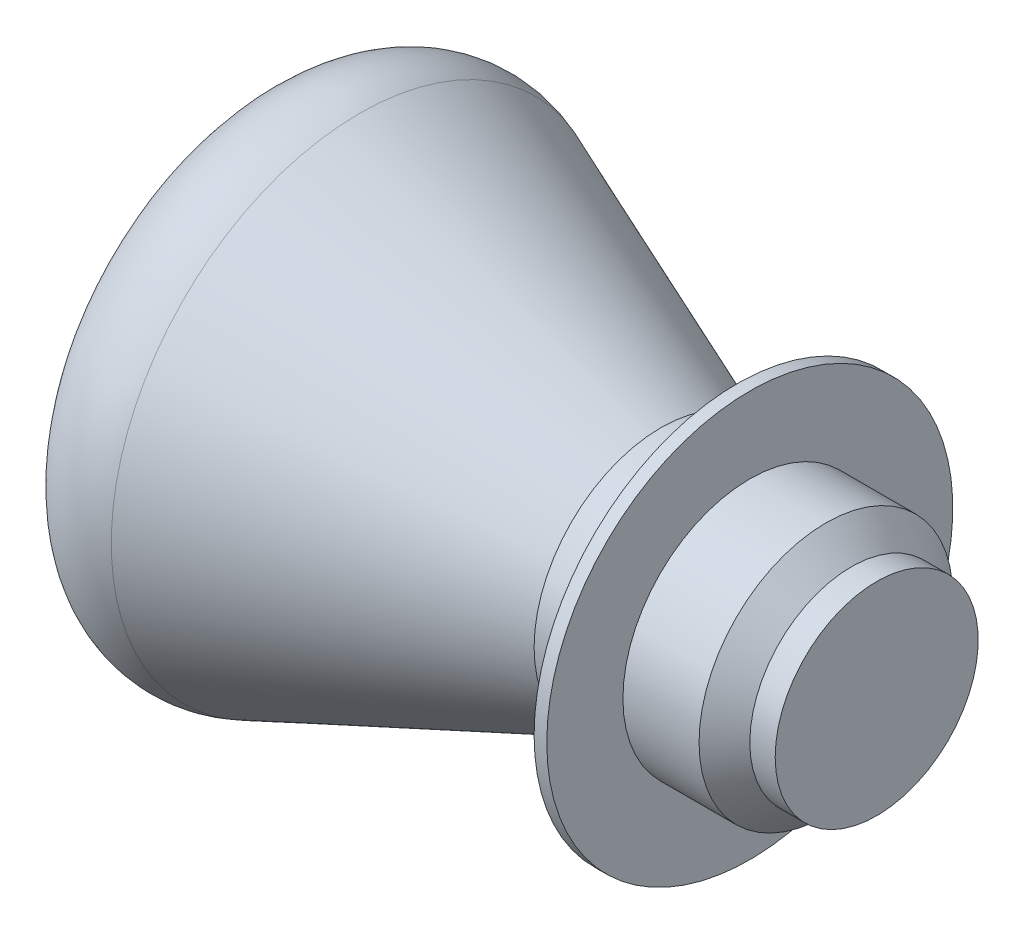
ISO-10303-21;
HEADER;
FILE_DESCRIPTION(('STEP AP214'),'2;1');
FILE_NAME('part.step','',(''),(''),'','','');
FILE_SCHEMA(('AUTOMOTIVE_DESIGN { 1 0 10303 214 1 1 1 1 }'));
ENDSEC;
DATA;
#1=APPLICATION_CONTEXT('core data for automotive mechanical design processes');
#2=APPLICATION_PROTOCOL_DEFINITION('international standard','automotive_design',2000,#1);
#3=PRODUCT_CONTEXT('',#1,'mechanical');
#4=PRODUCT('Part','Part','',(#3));
#5=PRODUCT_RELATED_PRODUCT_CATEGORY('part','',(#4));
#6=PRODUCT_DEFINITION_FORMATION('','',#4);
#7=PRODUCT_DEFINITION_CONTEXT('part definition',#1,'design');
#8=PRODUCT_DEFINITION('design','',#6,#7);
#9=PRODUCT_DEFINITION_SHAPE('','',#8);
#10=(LENGTH_UNIT() NAMED_UNIT(*) SI_UNIT(.MILLI.,.METRE.));
#11=(NAMED_UNIT(*) PLANE_ANGLE_UNIT() SI_UNIT($,.RADIAN.));
#12=(NAMED_UNIT(*) SI_UNIT($,.STERADIAN.) SOLID_ANGLE_UNIT());
#13=UNCERTAINTY_MEASURE_WITH_UNIT(LENGTH_MEASURE(1.E-05),#10,'distance_accuracy_value','');
#14=(GEOMETRIC_REPRESENTATION_CONTEXT(3) GLOBAL_UNCERTAINTY_ASSIGNED_CONTEXT((#13)) GLOBAL_UNIT_ASSIGNED_CONTEXT((#10,
#11,#12)) REPRESENTATION_CONTEXT('',''));
#15=CARTESIAN_POINT('',(0.,0.,0.));
#16=DIRECTION('',(0.,0.,1.));
#17=DIRECTION('',(1.,0.,0.));
#18=AXIS2_PLACEMENT_3D('',#15,#16,#17);
#19=CARTESIAN_POINT('',(0.,0.,0.));
#20=DIRECTION('',(1.,0.,0.));
#21=DIRECTION('',(0.,1.,0.));
#22=AXIS2_PLACEMENT_3D('',#19,#20,#21);
#23=PLANE('',#22);
#24=CARTESIAN_POINT('',(0.,0.,0.));
#25=DIRECTION('',(1.,0.,0.));
#26=DIRECTION('',(0.,1.,0.));
#27=AXIS2_PLACEMENT_3D('',#24,#25,#26);
#28=CIRCLE('',#27,5.);
#29=CARTESIAN_POINT('',(0.,5.,0.));
#30=VERTEX_POINT('',#29);
#31=EDGE_CURVE('E11',#30,#30,#28,.T.);
#32=ORIENTED_EDGE('',*,*,#31,.T.);
#33=EDGE_LOOP('',(#32));
#34=FACE_BOUND('',#33,.T.);
#35=ADVANCED_FACE('F47',(#34),#23,.T.);
#36=CARTESIAN_POINT('',(0.,0.,0.));
#37=DIRECTION('',(1.,0.,0.));
#38=DIRECTION('',(0.,1.,0.));
#39=AXIS2_PLACEMENT_3D('',#36,#37,#38);
#40=CYLINDRICAL_SURFACE('',#39,5.);
#41=CARTESIAN_POINT('',(-3.,0.,0.));
#42=DIRECTION('',(1.,0.,0.));
#43=DIRECTION('',(0.,1.,0.));
#44=AXIS2_PLACEMENT_3D('',#41,#42,#43);
#45=CIRCLE('',#44,5.);
#46=CARTESIAN_POINT('',(-3.,5.,0.));
#47=VERTEX_POINT('',#46);
#48=EDGE_CURVE('E54',#47,#47,#45,.T.);
#49=ORIENTED_EDGE('',*,*,#48,.T.);
#50=EDGE_LOOP('',(#49));
#51=FACE_BOUND('',#50,.T.);
#52=ORIENTED_EDGE('',*,*,#31,.F.);
#53=EDGE_LOOP('',(#52));
#54=FACE_BOUND('',#53,.T.);
#55=ADVANCED_FACE('F83',(#51,#54),#40,.T.);
#56=CARTESIAN_POINT('',(-3.,0.,0.));
#57=DIRECTION('',(-1.,0.,0.));
#58=DIRECTION('',(0.,-1.,0.));
#59=AXIS2_PLACEMENT_3D('',#56,#57,#58);
#60=CONICAL_SURFACE('',#59,5.,0.382760510475256);
#61=CARTESIAN_POINT('',(-14.8795520760162,0.,0.));
#62=DIRECTION('',(1.,0.,0.));
#63=DIRECTION('',(0.,1.,0.));
#64=AXIS2_PLACEMENT_3D('',#61,#62,#63);
#65=CIRCLE('',#64,9.78291150589458);
#66=CARTESIAN_POINT('',(-14.8795520760162,9.78291150589458,0.));
#67=VERTEX_POINT('',#66);
#68=EDGE_CURVE('E59',#67,#67,#65,.T.);
#69=ORIENTED_EDGE('',*,*,#68,.T.);
#70=EDGE_LOOP('',(#69));
#71=FACE_BOUND('',#70,.T.);
#72=ORIENTED_EDGE('',*,*,#48,.F.);
#73=EDGE_LOOP('',(#72));
#74=FACE_BOUND('',#73,.T.);
#75=ADVANCED_FACE('F80',(#71,#74),#60,.T.);
#76=CARTESIAN_POINT('',(-16.,0.,0.));
#77=DIRECTION('',(1.,0.,0.));
#78=DIRECTION('',(0.,1.,0.));
#79=AXIS2_PLACEMENT_3D('',#76,#77,#78);
#80=TOROIDAL_SURFACE('',#79,7.,3.);
#81=CARTESIAN_POINT('',(-18.8803910346565,0.,0.));
#82=DIRECTION('',(1.,0.,0.));
#83=DIRECTION('',(0.,1.,0.));
#84=AXIS2_PLACEMENT_3D('',#81,#82,#83);
#85=CIRCLE('',#84,7.83865814696486);
#86=CARTESIAN_POINT('',(-18.8803910346565,7.83865814696485,0.));
#87=VERTEX_POINT('',#86);
#88=EDGE_CURVE('E64',#87,#87,#85,.T.);
#89=ORIENTED_EDGE('',*,*,#88,.T.);
#90=EDGE_LOOP('',(#89));
#91=FACE_BOUND('',#90,.T.);
#92=ORIENTED_EDGE('',*,*,#68,.F.);
#93=EDGE_LOOP('',(#92));
#94=FACE_BOUND('',#93,.T.);
#95=ADVANCED_FACE('F71',(#91,#94),#80,.T.);
#96=CARTESIAN_POINT('',(8.04166383593282,0.,0.));
#97=DIRECTION('',(1.,0.,0.));
#98=DIRECTION('',(0.,1.,0.));
#99=AXIS2_PLACEMENT_3D('',#96,#97,#98);
#100=SPHERICAL_SURFACE('',#99,28.04);
#101=ORIENTED_EDGE('',*,*,#88,.F.);
#102=EDGE_LOOP('',(#101));
#103=FACE_BOUND('',#102,.T.);
#104=ADVANCED_FACE('F74',(#103),#100,.T.);
#105=CLOSED_SHELL('',(#35,#55,#75,#95,#104));
#106=MANIFOLD_SOLID_BREP('B2',#105);
#107=CARTESIAN_POINT('',(0.,4.5,0.));
#108=DIRECTION('',(1.,0.,0.));
#109=DIRECTION('',(0.,0.,-1.));
#110=AXIS2_PLACEMENT_3D('',#107,#108,#109);
#111=PLANE('',#110);
#112=CARTESIAN_POINT('',(0.,0.,0.));
#113=DIRECTION('',(-1.,0.,0.));
#114=DIRECTION('',(0.,0.,1.));
#115=AXIS2_PLACEMENT_3D('',#112,#113,#114);
#116=CIRCLE('',#115,4.5);
#117=CARTESIAN_POINT('',(0.,0.,4.5));
#118=VERTEX_POINT('',#117);
#119=EDGE_CURVE('E156',#118,#118,#116,.T.);
#120=ORIENTED_EDGE('',*,*,#119,.T.);
#121=EDGE_LOOP('',(#120));
#122=FACE_BOUND('',#121,.T.);
#123=ADVANCED_FACE('F122',(#122),#111,.F.);
#124=CARTESIAN_POINT('',(5.5,0.,0.));
#125=DIRECTION('',(-1.,0.,0.));
#126=DIRECTION('',(0.,0.,1.));
#127=AXIS2_PLACEMENT_3D('',#124,#125,#126);
#128=PLANE('',#127);
#129=CARTESIAN_POINT('',(5.5,0.,0.));
#130=DIRECTION('',(-1.,0.,0.));
#131=DIRECTION('',(0.,0.,1.));
#132=AXIS2_PLACEMENT_3D('',#129,#130,#131);
#133=CIRCLE('',#132,4.);
#134=CARTESIAN_POINT('',(5.5,0.,4.));
#135=VERTEX_POINT('',#134);
#136=EDGE_CURVE('E46',#135,#135,#133,.T.);
#137=ORIENTED_EDGE('',*,*,#136,.F.);
#138=EDGE_LOOP('',(#137));
#139=FACE_BOUND('',#138,.T.);
#140=ADVANCED_FACE('F210',(#139),#128,.F.);
#141=CARTESIAN_POINT('',(0.,0.,0.));
#142=DIRECTION('',(-1.,0.,0.));
#143=DIRECTION('',(0.,0.,1.));
#144=AXIS2_PLACEMENT_3D('',#141,#142,#143);
#145=CYLINDRICAL_SURFACE('',#144,4.);
#146=CARTESIAN_POINT('',(4.5,0.,0.));
#147=DIRECTION('',(-1.,0.,0.));
#148=DIRECTION('',(0.,0.,1.));
#149=AXIS2_PLACEMENT_3D('',#146,#147,#148);
#150=CIRCLE('',#149,4.);
#151=CARTESIAN_POINT('',(4.5,0.,4.));
#152=VERTEX_POINT('',#151);
#153=EDGE_CURVE('E128',#152,#152,#150,.T.);
#154=ORIENTED_EDGE('',*,*,#153,.F.);
#155=EDGE_LOOP('',(#154));
#156=FACE_BOUND('',#155,.T.);
#157=ORIENTED_EDGE('',*,*,#136,.T.);
#158=EDGE_LOOP('',(#157));
#159=FACE_BOUND('',#158,.T.);
#160=ADVANCED_FACE('F205',(#156,#159),#145,.T.);
#161=CARTESIAN_POINT('',(4.5,0.,0.));
#162=DIRECTION('',(-1.,0.,0.));
#163=DIRECTION('',(0.,0.,1.));
#164=AXIS2_PLACEMENT_3D('',#161,#162,#163);
#165=CONICAL_SURFACE('',#164,4.,0.785398163397449);
#166=CARTESIAN_POINT('',(3.5,0.,0.));
#167=DIRECTION('',(-1.,0.,0.));
#168=DIRECTION('',(0.,0.,1.));
#169=AXIS2_PLACEMENT_3D('',#166,#167,#168);
#170=CIRCLE('',#169,5.);
#171=CARTESIAN_POINT('',(3.5,0.,5.));
#172=VERTEX_POINT('',#171);
#173=EDGE_CURVE('E132',#172,#172,#170,.T.);
#174=ORIENTED_EDGE('',*,*,#173,.F.);
#175=EDGE_LOOP('',(#174));
#176=FACE_BOUND('',#175,.T.);
#177=ORIENTED_EDGE('',*,*,#153,.T.);
#178=EDGE_LOOP('',(#177));
#179=FACE_BOUND('',#178,.T.);
#180=ADVANCED_FACE('F200',(#176,#179),#165,.T.);
#181=CARTESIAN_POINT('',(0.,0.,0.));
#182=DIRECTION('',(-1.,0.,0.));
#183=DIRECTION('',(0.,0.,1.));
#184=AXIS2_PLACEMENT_3D('',#181,#182,#183);
#185=CYLINDRICAL_SURFACE('',#184,5.);
#186=CARTESIAN_POINT('',(0.499999999999999,0.,0.));
#187=DIRECTION('',(-1.,0.,0.));
#188=DIRECTION('',(0.,0.,1.));
#189=AXIS2_PLACEMENT_3D('',#186,#187,#188);
#190=CIRCLE('',#189,5.);
#191=CARTESIAN_POINT('',(0.499999999999999,0.,5.));
#192=VERTEX_POINT('',#191);
#193=EDGE_CURVE('E136',#192,#192,#190,.T.);
#194=ORIENTED_EDGE('',*,*,#193,.F.);
#195=EDGE_LOOP('',(#194));
#196=FACE_BOUND('',#195,.T.);
#197=ORIENTED_EDGE('',*,*,#173,.T.);
#198=EDGE_LOOP('',(#197));
#199=FACE_BOUND('',#198,.T.);
#200=ADVANCED_FACE('F194',(#196,#199),#185,.T.);
#201=CARTESIAN_POINT('',(0.499999999999998,5.,0.));
#202=DIRECTION('',(-1.,0.,0.));
#203=DIRECTION('',(0.,0.,1.));
#204=AXIS2_PLACEMENT_3D('',#201,#202,#203);
#205=PLANE('',#204);
#206=CARTESIAN_POINT('',(0.499999999999997,0.,0.));
#207=DIRECTION('',(-1.,0.,0.));
#208=DIRECTION('',(0.,0.,1.));
#209=AXIS2_PLACEMENT_3D('',#206,#207,#208);
#210=CIRCLE('',#209,8.);
#211=CARTESIAN_POINT('',(0.499999999999997,0.,8.));
#212=VERTEX_POINT('',#211);
#213=EDGE_CURVE('E141',#212,#212,#210,.T.);
#214=ORIENTED_EDGE('',*,*,#213,.F.);
#215=EDGE_LOOP('',(#214));
#216=FACE_BOUND('',#215,.T.);
#217=ORIENTED_EDGE('',*,*,#193,.T.);
#218=EDGE_LOOP('',(#217));
#219=FACE_BOUND('',#218,.T.);
#220=ADVANCED_FACE('F188',(#216,#219),#205,.F.);
#221=CARTESIAN_POINT('',(0.,0.,0.));
#222=DIRECTION('',(-1.,0.,0.));
#223=DIRECTION('',(0.,0.,1.));
#224=AXIS2_PLACEMENT_3D('',#221,#222,#223);
#225=CYLINDRICAL_SURFACE('',#224,8.);
#226=CARTESIAN_POINT('',(0.,0.,0.));
#227=DIRECTION('',(-1.,0.,0.));
#228=DIRECTION('',(0.,0.,1.));
#229=AXIS2_PLACEMENT_3D('',#226,#227,#228);
#230=CIRCLE('',#229,8.);
#231=CARTESIAN_POINT('',(0.,0.,8.));
#232=VERTEX_POINT('',#231);
#233=EDGE_CURVE('E144',#232,#232,#230,.T.);
#234=ORIENTED_EDGE('',*,*,#233,.F.);
#235=EDGE_LOOP('',(#234));
#236=FACE_BOUND('',#235,.T.);
#237=ORIENTED_EDGE('',*,*,#213,.T.);
#238=EDGE_LOOP('',(#237));
#239=FACE_BOUND('',#238,.T.);
#240=ADVANCED_FACE('F182',(#236,#239),#225,.T.);
#241=CARTESIAN_POINT('',(0.,5.,0.));
#242=DIRECTION('',(1.,0.,0.));
#243=DIRECTION('',(0.,0.,-1.));
#244=AXIS2_PLACEMENT_3D('',#241,#242,#243);
#245=PLANE('',#244);
#246=CARTESIAN_POINT('',(0.,0.,0.));
#247=DIRECTION('',(-1.,0.,0.));
#248=DIRECTION('',(0.,0.,1.));
#249=AXIS2_PLACEMENT_3D('',#246,#247,#248);
#250=CIRCLE('',#249,5.);
#251=CARTESIAN_POINT('',(0.,0.,5.));
#252=VERTEX_POINT('',#251);
#253=EDGE_CURVE('E147',#252,#252,#250,.T.);
#254=ORIENTED_EDGE('',*,*,#253,.F.);
#255=EDGE_LOOP('',(#254));
#256=FACE_BOUND('',#255,.T.);
#257=ORIENTED_EDGE('',*,*,#233,.T.);
#258=EDGE_LOOP('',(#257));
#259=FACE_BOUND('',#258,.T.);
#260=ADVANCED_FACE('F176',(#256,#259),#245,.F.);
#261=CARTESIAN_POINT('',(0.,0.,0.));
#262=DIRECTION('',(-1.,0.,0.));
#263=DIRECTION('',(0.,0.,1.));
#264=AXIS2_PLACEMENT_3D('',#261,#262,#263);
#265=CYLINDRICAL_SURFACE('',#264,5.);
#266=CARTESIAN_POINT('',(-2.,0.,0.));
#267=DIRECTION('',(-1.,0.,0.));
#268=DIRECTION('',(0.,0.,1.));
#269=AXIS2_PLACEMENT_3D('',#266,#267,#268);
#270=CIRCLE('',#269,5.);
#271=CARTESIAN_POINT('',(-2.,0.,5.));
#272=VERTEX_POINT('',#271);
#273=EDGE_CURVE('E150',#272,#272,#270,.T.);
#274=ORIENTED_EDGE('',*,*,#273,.F.);
#275=EDGE_LOOP('',(#274));
#276=FACE_BOUND('',#275,.T.);
#277=ORIENTED_EDGE('',*,*,#253,.T.);
#278=EDGE_LOOP('',(#277));
#279=FACE_BOUND('',#278,.T.);
#280=ADVANCED_FACE('F170',(#276,#279),#265,.T.);
#281=CARTESIAN_POINT('',(-2.,4.5,0.));
#282=DIRECTION('',(1.,0.,0.));
#283=DIRECTION('',(0.,0.,-1.));
#284=AXIS2_PLACEMENT_3D('',#281,#282,#283);
#285=PLANE('',#284);
#286=CARTESIAN_POINT('',(-2.,0.,0.));
#287=DIRECTION('',(-1.,0.,0.));
#288=DIRECTION('',(0.,0.,1.));
#289=AXIS2_PLACEMENT_3D('',#286,#287,#288);
#290=CIRCLE('',#289,4.5);
#291=CARTESIAN_POINT('',(-2.,0.,4.5));
#292=VERTEX_POINT('',#291);
#293=EDGE_CURVE('E153',#292,#292,#290,.T.);
#294=ORIENTED_EDGE('',*,*,#293,.F.);
#295=EDGE_LOOP('',(#294));
#296=FACE_BOUND('',#295,.T.);
#297=ORIENTED_EDGE('',*,*,#273,.T.);
#298=EDGE_LOOP('',(#297));
#299=FACE_BOUND('',#298,.T.);
#300=ADVANCED_FACE('F164',(#296,#299),#285,.F.);
#301=CARTESIAN_POINT('',(0.,0.,0.));
#302=DIRECTION('',(-1.,0.,0.));
#303=DIRECTION('',(0.,0.,1.));
#304=AXIS2_PLACEMENT_3D('',#301,#302,#303);
#305=CYLINDRICAL_SURFACE('',#304,4.5);
#306=ORIENTED_EDGE('',*,*,#119,.F.);
#307=EDGE_LOOP('',(#306));
#308=FACE_BOUND('',#307,.T.);
#309=ORIENTED_EDGE('',*,*,#293,.T.);
#310=EDGE_LOOP('',(#309));
#311=FACE_BOUND('',#310,.T.);
#312=ADVANCED_FACE('F161',(#308,#311),#305,.F.);
#313=CLOSED_SHELL('',(#123,#140,#160,#180,#200,#220,#240,#260,#280,#300,#312));
#314=MANIFOLD_SOLID_BREP('B6',#313);
#315=ADVANCED_BREP_SHAPE_REPRESENTATION('',(#18,#106,#314),#14);
#316=SHAPE_DEFINITION_REPRESENTATION(#9,#315);
ENDSEC;
END-ISO-10303-21;
